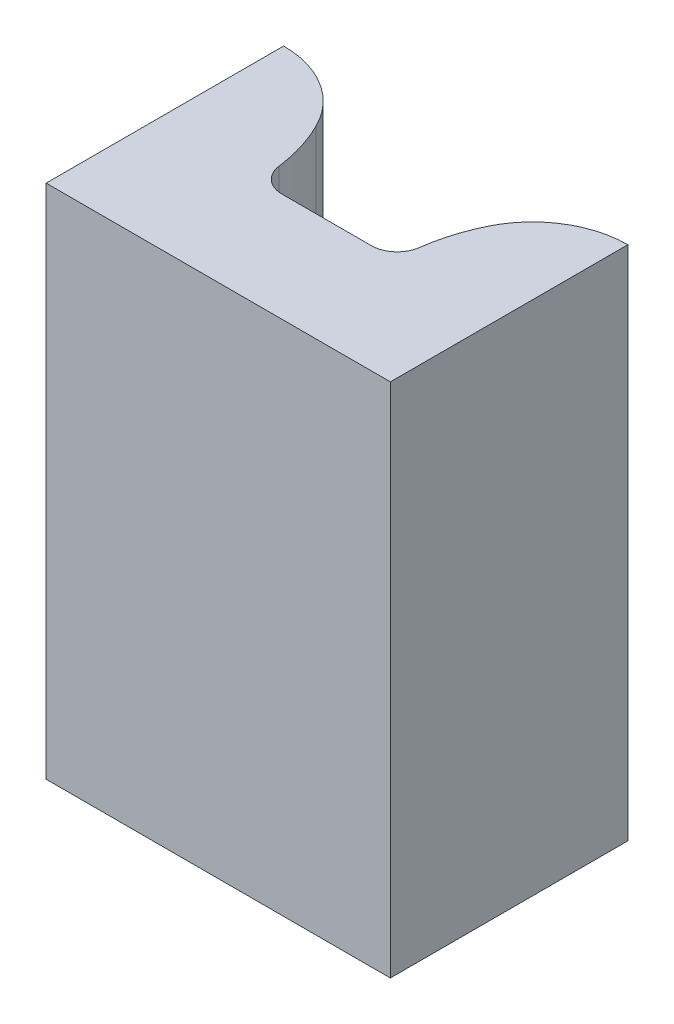
ISO-10303-21;
HEADER;
FILE_DESCRIPTION(('STEP AP214'),'2;1');
FILE_NAME('part.step','',(''),(''),'','','');
FILE_SCHEMA(('AUTOMOTIVE_DESIGN { 1 0 10303 214 1 1 1 1 }'));
ENDSEC;
DATA;
#1=APPLICATION_CONTEXT('core data for automotive mechanical design processes');
#2=APPLICATION_PROTOCOL_DEFINITION('international standard','automotive_design',2000,#1);
#3=PRODUCT_CONTEXT('',#1,'mechanical');
#4=PRODUCT('Part','Part','',(#3));
#5=PRODUCT_RELATED_PRODUCT_CATEGORY('part','',(#4));
#6=PRODUCT_DEFINITION_FORMATION('','',#4);
#7=PRODUCT_DEFINITION_CONTEXT('part definition',#1,'design');
#8=PRODUCT_DEFINITION('design','',#6,#7);
#9=PRODUCT_DEFINITION_SHAPE('','',#8);
#10=(LENGTH_UNIT() NAMED_UNIT(*) SI_UNIT(.MILLI.,.METRE.));
#11=(NAMED_UNIT(*) PLANE_ANGLE_UNIT() SI_UNIT($,.RADIAN.));
#12=(NAMED_UNIT(*) SI_UNIT($,.STERADIAN.) SOLID_ANGLE_UNIT());
#13=UNCERTAINTY_MEASURE_WITH_UNIT(LENGTH_MEASURE(1.E-05),#10,'distance_accuracy_value','');
#14=(GEOMETRIC_REPRESENTATION_CONTEXT(3) GLOBAL_UNCERTAINTY_ASSIGNED_CONTEXT((#13)) GLOBAL_UNIT_ASSIGNED_CONTEXT((#10,
#11,#12)) REPRESENTATION_CONTEXT('',''));
#15=CARTESIAN_POINT('',(0.,0.,0.));
#16=DIRECTION('',(0.,0.,1.));
#17=DIRECTION('',(1.,0.,0.));
#18=AXIS2_PLACEMENT_3D('',#15,#16,#17);
#19=CARTESIAN_POINT('',(0.,1.5,0.));
#20=DIRECTION('',(1.,0.,0.));
#21=DIRECTION('',(0.,0.,-1.));
#22=AXIS2_PLACEMENT_3D('',#19,#20,#21);
#23=PLANE('',#22);
#24=DIRECTION('',(0.,0.,1.));
#25=VECTOR('',#24,1.);
#26=CARTESIAN_POINT('',(0.,-1.5,0.));
#27=LINE('',#26,#25);
#28=CARTESIAN_POINT('',(0.,-1.5,-1.38));
#29=VERTEX_POINT('',#28);
#30=CARTESIAN_POINT('',(0.,-1.5,0.));
#31=VERTEX_POINT('',#30);
#32=EDGE_CURVE('E152',#29,#31,#27,.T.);
#33=ORIENTED_EDGE('',*,*,#32,.T.);
#34=DIRECTION('',(0.,-1.,0.));
#35=VECTOR('',#34,1.);
#36=CARTESIAN_POINT('',(0.,1.5,0.));
#37=LINE('',#36,#35);
#38=CARTESIAN_POINT('',(0.,1.5,0.));
#39=VERTEX_POINT('',#38);
#40=EDGE_CURVE('E11',#39,#31,#37,.T.);
#41=ORIENTED_EDGE('',*,*,#40,.F.);
#42=DIRECTION('',(0.,0.,1.));
#43=VECTOR('',#42,1.);
#44=CARTESIAN_POINT('',(0.,1.5,0.));
#45=LINE('',#44,#43);
#46=CARTESIAN_POINT('',(0.,1.5,-1.38));
#47=VERTEX_POINT('',#46);
#48=EDGE_CURVE('E180',#47,#39,#45,.T.);
#49=ORIENTED_EDGE('',*,*,#48,.F.);
#50=DIRECTION('',(0.,-1.,0.));
#51=VECTOR('',#50,1.);
#52=CARTESIAN_POINT('',(0.,1.5,-1.38));
#53=LINE('',#52,#51);
#54=EDGE_CURVE('E148',#47,#29,#53,.T.);
#55=ORIENTED_EDGE('',*,*,#54,.T.);
#56=EDGE_LOOP('',(#33,#41,#49,#55));
#57=FACE_BOUND('',#56,.T.);
#58=ADVANCED_FACE('F39',(#57),#23,.F.);
#59=CARTESIAN_POINT('',(0.,1.5,0.));
#60=DIRECTION('',(0.,0.,-1.));
#61=DIRECTION('',(-1.,0.,0.));
#62=AXIS2_PLACEMENT_3D('',#59,#60,#61);
#63=PLANE('',#62);
#64=DIRECTION('',(1.,0.,0.));
#65=VECTOR('',#64,1.);
#66=CARTESIAN_POINT('',(0.,-1.5,0.));
#67=LINE('',#66,#65);
#68=CARTESIAN_POINT('',(2.,-1.5,0.));
#69=VERTEX_POINT('',#68);
#70=EDGE_CURVE('E156',#31,#69,#67,.T.);
#71=ORIENTED_EDGE('',*,*,#70,.T.);
#72=DIRECTION('',(0.,-1.,0.));
#73=VECTOR('',#72,1.);
#74=CARTESIAN_POINT('',(2.,1.5,0.));
#75=LINE('',#74,#73);
#76=CARTESIAN_POINT('',(2.,1.5,0.));
#77=VERTEX_POINT('',#76);
#78=EDGE_CURVE('E48',#77,#69,#75,.T.);
#79=ORIENTED_EDGE('',*,*,#78,.F.);
#80=DIRECTION('',(1.,0.,0.));
#81=VECTOR('',#80,1.);
#82=CARTESIAN_POINT('',(0.,1.5,0.));
#83=LINE('',#82,#81);
#84=EDGE_CURVE('E105',#39,#77,#83,.T.);
#85=ORIENTED_EDGE('',*,*,#84,.F.);
#86=ORIENTED_EDGE('',*,*,#40,.T.);
#87=EDGE_LOOP('',(#71,#79,#85,#86));
#88=FACE_BOUND('',#87,.T.);
#89=ADVANCED_FACE('F244',(#88),#63,.F.);
#90=CARTESIAN_POINT('',(2.,1.5,0.));
#91=DIRECTION('',(-1.,0.,0.));
#92=DIRECTION('',(0.,0.,1.));
#93=AXIS2_PLACEMENT_3D('',#90,#91,#92);
#94=PLANE('',#93);
#95=DIRECTION('',(0.,0.,-1.));
#96=VECTOR('',#95,1.);
#97=CARTESIAN_POINT('',(2.,-1.5,0.));
#98=LINE('',#97,#96);
#99=CARTESIAN_POINT('',(2.,-1.5,-1.38));
#100=VERTEX_POINT('',#99);
#101=EDGE_CURVE('E159',#69,#100,#98,.T.);
#102=ORIENTED_EDGE('',*,*,#101,.T.);
#103=DIRECTION('',(0.,-1.,0.));
#104=VECTOR('',#103,1.);
#105=CARTESIAN_POINT('',(2.,1.5,-1.38));
#106=LINE('',#105,#104);
#107=CARTESIAN_POINT('',(2.,1.5,-1.38));
#108=VERTEX_POINT('',#107);
#109=EDGE_CURVE('E199',#108,#100,#106,.T.);
#110=ORIENTED_EDGE('',*,*,#109,.F.);
#111=DIRECTION('',(0.,0.,-1.));
#112=VECTOR('',#111,1.);
#113=CARTESIAN_POINT('',(2.,1.5,0.));
#114=LINE('',#113,#112);
#115=EDGE_CURVE('E209',#77,#108,#114,.T.);
#116=ORIENTED_EDGE('',*,*,#115,.F.);
#117=ORIENTED_EDGE('',*,*,#78,.T.);
#118=EDGE_LOOP('',(#102,#110,#116,#117));
#119=FACE_BOUND('',#118,.T.);
#120=ADVANCED_FACE('F207',(#119),#94,.F.);
#121=CARTESIAN_POINT('',(2.,1.5,-0.825));
#122=DIRECTION('',(0.,-1.,0.));
#123=DIRECTION('',(0.,0.,-1.));
#124=AXIS2_PLACEMENT_3D('',#121,#122,#123);
#125=CYLINDRICAL_SURFACE('',#124,0.555);
#126=CARTESIAN_POINT('',(2.,-1.5,-0.825));
#127=DIRECTION('',(0.,1.,0.));
#128=DIRECTION('',(0.,0.,1.));
#129=AXIS2_PLACEMENT_3D('',#126,#127,#128);
#130=CIRCLE('',#129,0.555);
#131=CARTESIAN_POINT('',(1.50112359550562,-1.5,-1.06820224719101));
#132=VERTEX_POINT('',#131);
#133=EDGE_CURVE('E162',#100,#132,#130,.T.);
#134=ORIENTED_EDGE('',*,*,#133,.T.);
#135=DIRECTION('',(0.,-1.,0.));
#136=VECTOR('',#135,1.);
#137=CARTESIAN_POINT('',(1.50112359550562,1.5,-1.06820224719101));
#138=LINE('',#137,#136);
#139=CARTESIAN_POINT('',(1.50112359550562,1.5,-1.06820224719101));
#140=VERTEX_POINT('',#139);
#141=EDGE_CURVE('E195',#140,#132,#138,.T.);
#142=ORIENTED_EDGE('',*,*,#141,.F.);
#143=CARTESIAN_POINT('',(2.,1.5,-0.825));
#144=DIRECTION('',(0.,1.,0.));
#145=DIRECTION('',(0.,0.,1.));
#146=AXIS2_PLACEMENT_3D('',#143,#144,#145);
#147=CIRCLE('',#146,0.555);
#148=EDGE_CURVE('E228',#108,#140,#147,.T.);
#149=ORIENTED_EDGE('',*,*,#148,.F.);
#150=ORIENTED_EDGE('',*,*,#109,.T.);
#151=EDGE_LOOP('',(#134,#142,#149,#150));
#152=FACE_BOUND('',#151,.T.);
#153=ADVANCED_FACE('F218',(#152),#125,.T.);
#154=CARTESIAN_POINT('',(2.4,1.5,-0.63));
#155=DIRECTION('',(0.,-1.,0.));
#156=DIRECTION('',(0.,0.,-1.));
#157=AXIS2_PLACEMENT_3D('',#154,#155,#156);
#158=CYLINDRICAL_SURFACE('',#157,1.);
#159=CARTESIAN_POINT('',(2.4,-1.5,-0.63));
#160=DIRECTION('',(0.,1.,0.));
#161=DIRECTION('',(0.,0.,1.));
#162=AXIS2_PLACEMENT_3D('',#159,#160,#161);
#163=CIRCLE('',#162,1.);
#164=CARTESIAN_POINT('',(1.40854310860944,-1.5,-0.760434782608695));
#165=VERTEX_POINT('',#164);
#166=EDGE_CURVE('E165',#132,#165,#163,.T.);
#167=ORIENTED_EDGE('',*,*,#166,.T.);
#168=DIRECTION('',(0.,-1.,0.));
#169=VECTOR('',#168,1.);
#170=CARTESIAN_POINT('',(1.40854310860944,1.5,-0.760434782608695));
#171=LINE('',#170,#169);
#172=CARTESIAN_POINT('',(1.40854310860944,1.5,-0.760434782608695));
#173=VERTEX_POINT('',#172);
#174=EDGE_CURVE('E191',#173,#165,#171,.T.);
#175=ORIENTED_EDGE('',*,*,#174,.F.);
#176=CARTESIAN_POINT('',(2.4,1.5,-0.63));
#177=DIRECTION('',(0.,1.,0.));
#178=DIRECTION('',(0.,0.,1.));
#179=AXIS2_PLACEMENT_3D('',#176,#177,#178);
#180=CIRCLE('',#179,1.);
#181=EDGE_CURVE('E224',#140,#173,#180,.T.);
#182=ORIENTED_EDGE('',*,*,#181,.F.);
#183=ORIENTED_EDGE('',*,*,#141,.T.);
#184=EDGE_LOOP('',(#167,#175,#182,#183));
#185=FACE_BOUND('',#184,.T.);
#186=ADVANCED_FACE('F222',(#185),#158,.T.);
#187=CARTESIAN_POINT('',(1.25982457490086,1.5,-0.779999999999999));
#188=DIRECTION('',(0.,-1.,0.));
#189=DIRECTION('',(0.,0.,-1.));
#190=AXIS2_PLACEMENT_3D('',#187,#188,#189);
#191=CYLINDRICAL_SURFACE('',#190,0.15);
#192=CARTESIAN_POINT('',(1.25982457490086,-1.5,-0.779999999999999));
#193=DIRECTION('',(0.,-1.,0.));
#194=DIRECTION('',(0.,0.,-1.));
#195=AXIS2_PLACEMENT_3D('',#192,#193,#194);
#196=CIRCLE('',#195,0.15);
#197=CARTESIAN_POINT('',(1.25982457490086,-1.5,-0.63));
#198=VERTEX_POINT('',#197);
#199=EDGE_CURVE('E168',#165,#198,#196,.T.);
#200=ORIENTED_EDGE('',*,*,#199,.T.);
#201=DIRECTION('',(0.,-1.,0.));
#202=VECTOR('',#201,1.);
#203=CARTESIAN_POINT('',(1.25982457490086,1.5,-0.63));
#204=LINE('',#203,#202);
#205=CARTESIAN_POINT('',(1.25982457490086,1.5,-0.63));
#206=VERTEX_POINT('',#205);
#207=EDGE_CURVE('E187',#206,#198,#204,.T.);
#208=ORIENTED_EDGE('',*,*,#207,.F.);
#209=CARTESIAN_POINT('',(1.25982457490086,1.5,-0.779999999999999));
#210=DIRECTION('',(0.,-1.,0.));
#211=DIRECTION('',(0.,0.,-1.));
#212=AXIS2_PLACEMENT_3D('',#209,#210,#211);
#213=CIRCLE('',#212,0.15);
#214=EDGE_CURVE('E227',#173,#206,#213,.T.);
#215=ORIENTED_EDGE('',*,*,#214,.F.);
#216=ORIENTED_EDGE('',*,*,#174,.T.);
#217=EDGE_LOOP('',(#200,#208,#215,#216));
#218=FACE_BOUND('',#217,.T.);
#219=ADVANCED_FACE('F256',(#218),#191,.F.);
#220=CARTESIAN_POINT('',(0.740175425099138,1.5,-0.63));
#221=DIRECTION('',(0.,0.,1.));
#222=DIRECTION('',(1.,0.,0.));
#223=AXIS2_PLACEMENT_3D('',#220,#221,#222);
#224=PLANE('',#223);
#225=DIRECTION('',(-1.,0.,0.));
#226=VECTOR('',#225,1.);
#227=CARTESIAN_POINT('',(0.740175425099138,-1.5,-0.63));
#228=LINE('',#227,#226);
#229=CARTESIAN_POINT('',(0.740175425099138,-1.5,-0.63));
#230=VERTEX_POINT('',#229);
#231=EDGE_CURVE('E171',#198,#230,#228,.T.);
#232=ORIENTED_EDGE('',*,*,#231,.T.);
#233=DIRECTION('',(0.,-1.,0.));
#234=VECTOR('',#233,1.);
#235=CARTESIAN_POINT('',(0.740175425099138,1.5,-0.63));
#236=LINE('',#235,#234);
#237=CARTESIAN_POINT('',(0.740175425099138,1.5,-0.63));
#238=VERTEX_POINT('',#237);
#239=EDGE_CURVE('E141',#238,#230,#236,.T.);
#240=ORIENTED_EDGE('',*,*,#239,.F.);
#241=DIRECTION('',(-1.,0.,0.));
#242=VECTOR('',#241,1.);
#243=CARTESIAN_POINT('',(0.740175425099138,1.5,-0.63));
#244=LINE('',#243,#242);
#245=EDGE_CURVE('E130',#206,#238,#244,.T.);
#246=ORIENTED_EDGE('',*,*,#245,.F.);
#247=ORIENTED_EDGE('',*,*,#207,.T.);
#248=EDGE_LOOP('',(#232,#240,#246,#247));
#249=FACE_BOUND('',#248,.T.);
#250=ADVANCED_FACE('F259',(#249),#224,.F.);
#251=CARTESIAN_POINT('',(0.740175425099138,1.5,-0.78));
#252=DIRECTION('',(0.,-1.,0.));
#253=DIRECTION('',(0.,0.,-1.));
#254=AXIS2_PLACEMENT_3D('',#251,#252,#253);
#255=CYLINDRICAL_SURFACE('',#254,0.15);
#256=CARTESIAN_POINT('',(0.740175425099138,-1.5,-0.78));
#257=DIRECTION('',(0.,-1.,0.));
#258=DIRECTION('',(0.,0.,1.));
#259=AXIS2_PLACEMENT_3D('',#256,#257,#258);
#260=CIRCLE('',#259,0.15);
#261=CARTESIAN_POINT('',(0.591456891390555,-1.5,-0.760434782608695));
#262=VERTEX_POINT('',#261);
#263=EDGE_CURVE('E139',#230,#262,#260,.T.);
#264=ORIENTED_EDGE('',*,*,#263,.T.);
#265=DIRECTION('',(0.,-1.,0.));
#266=VECTOR('',#265,1.);
#267=CARTESIAN_POINT('',(0.591456891390555,1.5,-0.760434782608695));
#268=LINE('',#267,#266);
#269=CARTESIAN_POINT('',(0.591456891390555,1.5,-0.760434782608695));
#270=VERTEX_POINT('',#269);
#271=EDGE_CURVE('E136',#270,#262,#268,.T.);
#272=ORIENTED_EDGE('',*,*,#271,.F.);
#273=CARTESIAN_POINT('',(0.740175425099138,1.5,-0.78));
#274=DIRECTION('',(0.,-1.,0.));
#275=DIRECTION('',(0.,0.,1.));
#276=AXIS2_PLACEMENT_3D('',#273,#274,#275);
#277=CIRCLE('',#276,0.15);
#278=EDGE_CURVE('E124',#238,#270,#277,.T.);
#279=ORIENTED_EDGE('',*,*,#278,.F.);
#280=ORIENTED_EDGE('',*,*,#239,.T.);
#281=EDGE_LOOP('',(#264,#272,#279,#280));
#282=FACE_BOUND('',#281,.T.);
#283=ADVANCED_FACE('F137',(#282),#255,.F.);
#284=CARTESIAN_POINT('',(-0.4,1.5,-0.63));
#285=DIRECTION('',(0.,-1.,0.));
#286=DIRECTION('',(0.,0.,-1.));
#287=AXIS2_PLACEMENT_3D('',#284,#285,#286);
#288=CYLINDRICAL_SURFACE('',#287,1.);
#289=CARTESIAN_POINT('',(-0.4,-1.5,-0.63));
#290=DIRECTION('',(0.,1.,0.));
#291=DIRECTION('',(0.,0.,1.));
#292=AXIS2_PLACEMENT_3D('',#289,#290,#291);
#293=CIRCLE('',#292,1.);
#294=CARTESIAN_POINT('',(0.498876404494382,-1.5,-1.06820224719101));
#295=VERTEX_POINT('',#294);
#296=EDGE_CURVE('E91',#262,#295,#293,.T.);
#297=ORIENTED_EDGE('',*,*,#296,.T.);
#298=DIRECTION('',(0.,-1.,0.));
#299=VECTOR('',#298,1.);
#300=CARTESIAN_POINT('',(0.498876404494382,1.5,-1.06820224719101));
#301=LINE('',#300,#299);
#302=CARTESIAN_POINT('',(0.498876404494382,1.5,-1.06820224719101));
#303=VERTEX_POINT('',#302);
#304=EDGE_CURVE('E142',#303,#295,#301,.T.);
#305=ORIENTED_EDGE('',*,*,#304,.F.);
#306=CARTESIAN_POINT('',(-0.4,1.5,-0.63));
#307=DIRECTION('',(0.,1.,0.));
#308=DIRECTION('',(0.,0.,1.));
#309=AXIS2_PLACEMENT_3D('',#306,#307,#308);
#310=CIRCLE('',#309,1.);
#311=EDGE_CURVE('E128',#270,#303,#310,.T.);
#312=ORIENTED_EDGE('',*,*,#311,.F.);
#313=ORIENTED_EDGE('',*,*,#271,.T.);
#314=EDGE_LOOP('',(#297,#305,#312,#313));
#315=FACE_BOUND('',#314,.T.);
#316=ADVANCED_FACE('F144',(#315),#288,.T.);
#317=CARTESIAN_POINT('',(0.,1.5,-0.825));
#318=DIRECTION('',(0.,-1.,0.));
#319=DIRECTION('',(0.,0.,-1.));
#320=AXIS2_PLACEMENT_3D('',#317,#318,#319);
#321=CYLINDRICAL_SURFACE('',#320,0.555);
#322=CARTESIAN_POINT('',(0.,-1.5,-0.825));
#323=DIRECTION('',(0.,1.,0.));
#324=DIRECTION('',(0.,0.,1.));
#325=AXIS2_PLACEMENT_3D('',#322,#323,#324);
#326=CIRCLE('',#325,0.555);
#327=EDGE_CURVE('E97',#295,#29,#326,.T.);
#328=ORIENTED_EDGE('',*,*,#327,.T.);
#329=ORIENTED_EDGE('',*,*,#54,.F.);
#330=CARTESIAN_POINT('',(0.,1.5,-0.825));
#331=DIRECTION('',(0.,1.,0.));
#332=DIRECTION('',(0.,0.,1.));
#333=AXIS2_PLACEMENT_3D('',#330,#331,#332);
#334=CIRCLE('',#333,0.555);
#335=EDGE_CURVE('E56',#303,#47,#334,.T.);
#336=ORIENTED_EDGE('',*,*,#335,.F.);
#337=ORIENTED_EDGE('',*,*,#304,.T.);
#338=EDGE_LOOP('',(#328,#329,#336,#337));
#339=FACE_BOUND('',#338,.T.);
#340=ADVANCED_FACE('F268',(#339),#321,.T.);
#341=CARTESIAN_POINT('',(0.,1.5,-0.825));
#342=DIRECTION('',(0.,1.,0.));
#343=DIRECTION('',(0.,0.,1.));
#344=AXIS2_PLACEMENT_3D('',#341,#342,#343);
#345=PLANE('',#344);
#346=ORIENTED_EDGE('',*,*,#48,.T.);
#347=ORIENTED_EDGE('',*,*,#84,.T.);
#348=ORIENTED_EDGE('',*,*,#115,.T.);
#349=ORIENTED_EDGE('',*,*,#148,.T.);
#350=ORIENTED_EDGE('',*,*,#181,.T.);
#351=ORIENTED_EDGE('',*,*,#214,.T.);
#352=ORIENTED_EDGE('',*,*,#245,.T.);
#353=ORIENTED_EDGE('',*,*,#278,.T.);
#354=ORIENTED_EDGE('',*,*,#311,.T.);
#355=ORIENTED_EDGE('',*,*,#335,.T.);
#356=EDGE_LOOP('',(#346,#347,#348,#349,#350,#351,#352,#353,#354,#355));
#357=FACE_BOUND('',#356,.T.);
#358=ADVANCED_FACE('F126',(#357),#345,.T.);
#359=CARTESIAN_POINT('',(0.,-1.5,-0.825));
#360=DIRECTION('',(0.,1.,0.));
#361=DIRECTION('',(0.,0.,1.));
#362=AXIS2_PLACEMENT_3D('',#359,#360,#361);
#363=PLANE('',#362);
#364=ORIENTED_EDGE('',*,*,#32,.F.);
#365=ORIENTED_EDGE('',*,*,#327,.F.);
#366=ORIENTED_EDGE('',*,*,#296,.F.);
#367=ORIENTED_EDGE('',*,*,#263,.F.);
#368=ORIENTED_EDGE('',*,*,#231,.F.);
#369=ORIENTED_EDGE('',*,*,#199,.F.);
#370=ORIENTED_EDGE('',*,*,#166,.F.);
#371=ORIENTED_EDGE('',*,*,#133,.F.);
#372=ORIENTED_EDGE('',*,*,#101,.F.);
#373=ORIENTED_EDGE('',*,*,#70,.F.);
#374=EDGE_LOOP('',(#364,#365,#366,#367,#368,#369,#370,#371,#372,#373));
#375=FACE_BOUND('',#374,.T.);
#376=ADVANCED_FACE('F213',(#375),#363,.F.);
#377=CLOSED_SHELL('',(#58,#89,#120,#153,#186,#219,#250,#283,#316,#340,#358,#376));
#378=MANIFOLD_SOLID_BREP('B2',#377);
#379=ADVANCED_BREP_SHAPE_REPRESENTATION('',(#18,#378),#14);
#380=SHAPE_DEFINITION_REPRESENTATION(#9,#379);
ENDSEC;
END-ISO-10303-21;
